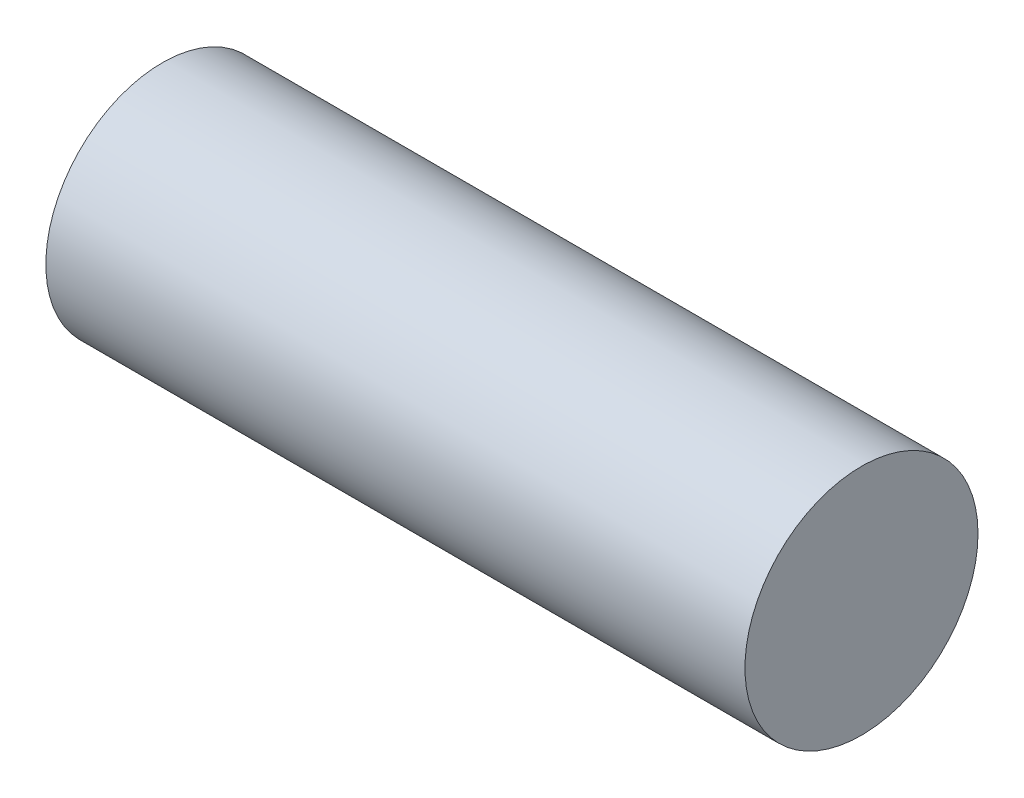
ISO-10303-21;
HEADER;
FILE_DESCRIPTION(('STEP AP214'),'2;1');
FILE_NAME('part.step','',(''),(''),'','','');
FILE_SCHEMA(('AUTOMOTIVE_DESIGN { 1 0 10303 214 1 1 1 1 }'));
ENDSEC;
DATA;
#1=APPLICATION_CONTEXT('core data for automotive mechanical design processes');
#2=APPLICATION_PROTOCOL_DEFINITION('international standard','automotive_design',2000,#1);
#3=PRODUCT_CONTEXT('',#1,'mechanical');
#4=PRODUCT('Part','Part','',(#3));
#5=PRODUCT_RELATED_PRODUCT_CATEGORY('part','',(#4));
#6=PRODUCT_DEFINITION_FORMATION('','',#4);
#7=PRODUCT_DEFINITION_CONTEXT('part definition',#1,'design');
#8=PRODUCT_DEFINITION('design','',#6,#7);
#9=PRODUCT_DEFINITION_SHAPE('','',#8);
#10=(LENGTH_UNIT() NAMED_UNIT(*) SI_UNIT(.MILLI.,.METRE.));
#11=(NAMED_UNIT(*) PLANE_ANGLE_UNIT() SI_UNIT($,.RADIAN.));
#12=(NAMED_UNIT(*) SI_UNIT($,.STERADIAN.) SOLID_ANGLE_UNIT());
#13=UNCERTAINTY_MEASURE_WITH_UNIT(LENGTH_MEASURE(1.E-05),#10,'distance_accuracy_value','');
#14=(GEOMETRIC_REPRESENTATION_CONTEXT(3) GLOBAL_UNCERTAINTY_ASSIGNED_CONTEXT((#13)) GLOBAL_UNIT_ASSIGNED_CONTEXT((#10,
#11,#12)) REPRESENTATION_CONTEXT('',''));
#15=CARTESIAN_POINT('',(0.,0.,0.));
#16=DIRECTION('',(0.,0.,1.));
#17=DIRECTION('',(1.,0.,0.));
#18=AXIS2_PLACEMENT_3D('',#15,#16,#17);
#19=CARTESIAN_POINT('',(30.,0.,0.));
#20=DIRECTION('',(-1.,0.,0.));
#21=DIRECTION('',(0.,0.,1.));
#22=AXIS2_PLACEMENT_3D('',#19,#20,#21);
#23=CYLINDRICAL_SURFACE('',#22,5.);
#24=CARTESIAN_POINT('',(30.,0.,0.));
#25=DIRECTION('',(1.,0.,0.));
#26=DIRECTION('',(0.,0.,-1.));
#27=AXIS2_PLACEMENT_3D('',#24,#25,#26);
#28=CIRCLE('',#27,5.);
#29=CARTESIAN_POINT('',(30.,0.,-5.));
#30=VERTEX_POINT('',#29);
#31=EDGE_CURVE('E10',#30,#30,#28,.T.);
#32=ORIENTED_EDGE('',*,*,#31,.F.);
#33=EDGE_LOOP('',(#32));
#34=FACE_BOUND('',#33,.T.);
#35=CARTESIAN_POINT('',(0.,0.,0.));
#36=DIRECTION('',(1.,0.,0.));
#37=DIRECTION('',(0.,0.,-1.));
#38=AXIS2_PLACEMENT_3D('',#35,#36,#37);
#39=CIRCLE('',#38,5.);
#40=CARTESIAN_POINT('',(0.,0.,-5.));
#41=VERTEX_POINT('',#40);
#42=EDGE_CURVE('E37',#41,#41,#39,.T.);
#43=ORIENTED_EDGE('',*,*,#42,.T.);
#44=EDGE_LOOP('',(#43));
#45=FACE_BOUND('',#44,.T.);
#46=ADVANCED_FACE('F40',(#34,#45),#23,.T.);
#47=CARTESIAN_POINT('',(30.,0.,0.));
#48=DIRECTION('',(1.,0.,0.));
#49=DIRECTION('',(0.,0.,-1.));
#50=AXIS2_PLACEMENT_3D('',#47,#48,#49);
#51=PLANE('',#50);
#52=ORIENTED_EDGE('',*,*,#31,.T.);
#53=EDGE_LOOP('',(#52));
#54=FACE_BOUND('',#53,.T.);
#55=ADVANCED_FACE('F67',(#54),#51,.T.);
#56=CARTESIAN_POINT('',(0.,0.,0.));
#57=DIRECTION('',(1.,0.,0.));
#58=DIRECTION('',(0.,0.,-1.));
#59=AXIS2_PLACEMENT_3D('',#56,#57,#58);
#60=PLANE('',#59);
#61=CARTESIAN_POINT('',(0.,0.,0.));
#62=DIRECTION('',(-1.,0.,0.));
#63=DIRECTION('',(0.,0.,1.));
#64=AXIS2_PLACEMENT_3D('',#61,#62,#63);
#65=CIRCLE('',#64,1.5);
#66=CARTESIAN_POINT('',(0.,0.,1.5));
#67=VERTEX_POINT('',#66);
#68=EDGE_CURVE('E47',#67,#67,#65,.T.);
#69=ORIENTED_EDGE('',*,*,#68,.F.);
#70=EDGE_LOOP('',(#69));
#71=FACE_BOUND('',#70,.T.);
#72=ORIENTED_EDGE('',*,*,#42,.F.);
#73=EDGE_LOOP('',(#72));
#74=FACE_BOUND('',#73,.T.);
#75=ADVANCED_FACE('F58',(#71,#74),#60,.F.);
#76=CARTESIAN_POINT('',(20.,0.,0.));
#77=DIRECTION('',(-1.,0.,0.));
#78=DIRECTION('',(0.,0.,1.));
#79=AXIS2_PLACEMENT_3D('',#76,#77,#78);
#80=CYLINDRICAL_SURFACE('',#79,1.5);
#81=CARTESIAN_POINT('',(20.,0.,0.));
#82=DIRECTION('',(-1.,0.,0.));
#83=DIRECTION('',(0.,0.,1.));
#84=AXIS2_PLACEMENT_3D('',#81,#82,#83);
#85=CIRCLE('',#84,1.5);
#86=CARTESIAN_POINT('',(20.,0.,1.5));
#87=VERTEX_POINT('',#86);
#88=EDGE_CURVE('E50',#87,#87,#85,.T.);
#89=ORIENTED_EDGE('',*,*,#88,.F.);
#90=EDGE_LOOP('',(#89));
#91=FACE_BOUND('',#90,.T.);
#92=ORIENTED_EDGE('',*,*,#68,.T.);
#93=EDGE_LOOP('',(#92));
#94=FACE_BOUND('',#93,.T.);
#95=ADVANCED_FACE('F60',(#91,#94),#80,.F.);
#96=CARTESIAN_POINT('',(20.,0.,0.));
#97=DIRECTION('',(-1.,0.,0.));
#98=DIRECTION('',(0.,0.,1.));
#99=AXIS2_PLACEMENT_3D('',#96,#97,#98);
#100=PLANE('',#99);
#101=ORIENTED_EDGE('',*,*,#88,.T.);
#102=EDGE_LOOP('',(#101));
#103=FACE_BOUND('',#102,.T.);
#104=ADVANCED_FACE('F54',(#103),#100,.T.);
#105=CLOSED_SHELL('',(#46,#55,#75,#95,#104));
#106=MANIFOLD_SOLID_BREP('B2',#105);
#107=ADVANCED_BREP_SHAPE_REPRESENTATION('',(#18,#106),#14);
#108=SHAPE_DEFINITION_REPRESENTATION(#9,#107);
ENDSEC;
END-ISO-10303-21;
